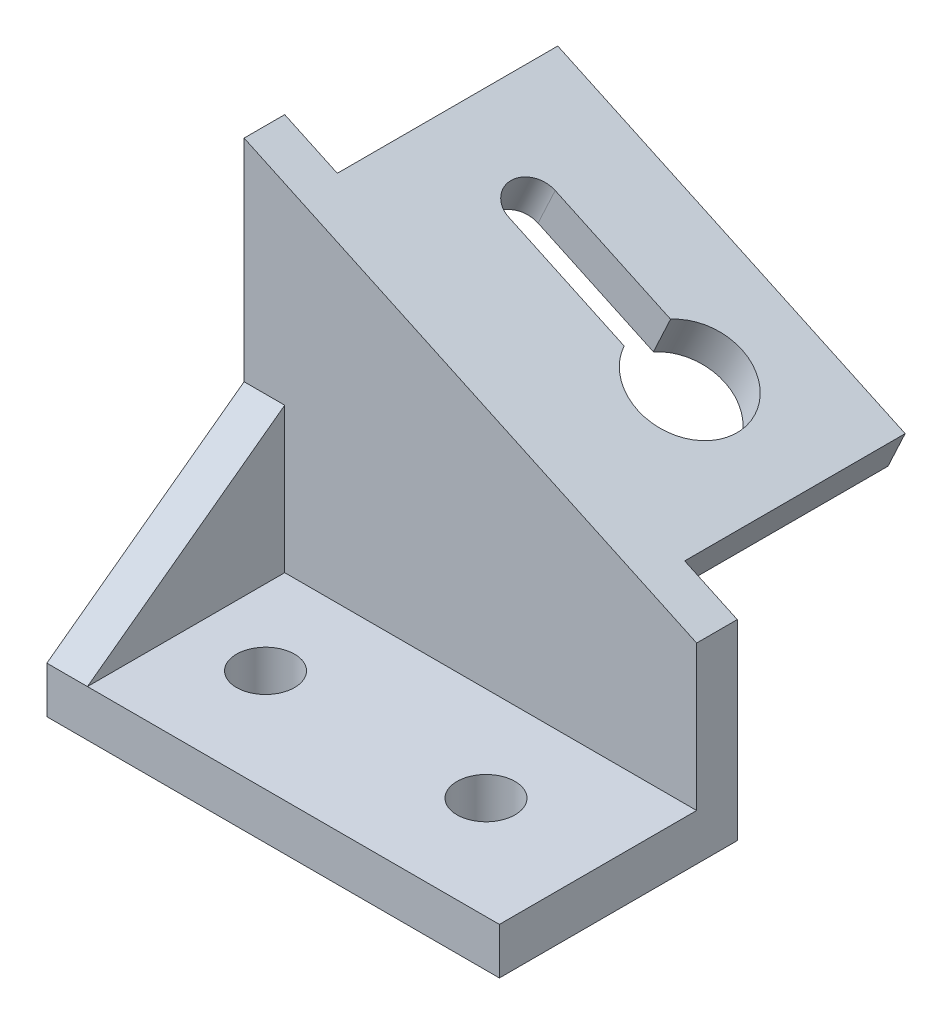
ISO-10303-21;
HEADER;
FILE_DESCRIPTION(('STEP AP214'),'2;1');
FILE_NAME('part.step','',(''),(''),'','','');
FILE_SCHEMA(('AUTOMOTIVE_DESIGN { 1 0 10303 214 1 1 1 1 }'));
ENDSEC;
DATA;
#1=APPLICATION_CONTEXT('core data for automotive mechanical design processes');
#2=APPLICATION_PROTOCOL_DEFINITION('international standard','automotive_design',2000,#1);
#3=PRODUCT_CONTEXT('',#1,'mechanical');
#4=PRODUCT('Part','Part','',(#3));
#5=PRODUCT_RELATED_PRODUCT_CATEGORY('part','',(#4));
#6=PRODUCT_DEFINITION_FORMATION('','',#4);
#7=PRODUCT_DEFINITION_CONTEXT('part definition',#1,'design');
#8=PRODUCT_DEFINITION('design','',#6,#7);
#9=PRODUCT_DEFINITION_SHAPE('','',#8);
#10=(LENGTH_UNIT() NAMED_UNIT(*) SI_UNIT(.MILLI.,.METRE.));
#11=(NAMED_UNIT(*) PLANE_ANGLE_UNIT() SI_UNIT($,.RADIAN.));
#12=(NAMED_UNIT(*) SI_UNIT($,.STERADIAN.) SOLID_ANGLE_UNIT());
#13=UNCERTAINTY_MEASURE_WITH_UNIT(LENGTH_MEASURE(1.E-05),#10,'distance_accuracy_value','');
#14=(GEOMETRIC_REPRESENTATION_CONTEXT(3) GLOBAL_UNCERTAINTY_ASSIGNED_CONTEXT((#13)) GLOBAL_UNIT_ASSIGNED_CONTEXT((#10,
#11,#12)) REPRESENTATION_CONTEXT('',''));
#15=CARTESIAN_POINT('',(0.,0.,0.));
#16=DIRECTION('',(0.,0.,1.));
#17=DIRECTION('',(1.,0.,0.));
#18=AXIS2_PLACEMENT_3D('',#15,#16,#17);
#19=CARTESIAN_POINT('',(0.,80.,-41.));
#20=DIRECTION('',(0.,0.,1.));
#21=DIRECTION('',(1.,0.,0.));
#22=AXIS2_PLACEMENT_3D('',#19,#20,#21);
#23=PLANE('',#22);
#24=DIRECTION('',(0.422618261740694,0.906307787036653,0.));
#25=VECTOR('',#24,1.);
#26=CARTESIAN_POINT('',(6.10475003818167,58.8016602094258,-41.));
#27=LINE('',#26,#25);
#28=CARTESIAN_POINT('',(6.10475003818167,58.8016602094258,-41.));
#29=VERTEX_POINT('',#28);
#30=CARTESIAN_POINT('',(9.06307787036652,65.1458147186823,-41.));
#31=VERTEX_POINT('',#30);
#32=EDGE_CURVE('E214',#29,#31,#27,.T.);
#33=ORIENTED_EDGE('',*,*,#32,.F.);
#34=DIRECTION('',(-0.906307787036653,0.422618261740694,0.));
#35=VECTOR('',#34,1.);
#36=CARTESIAN_POINT('',(23.6126887015027,50.6375743322113,-41.));
#37=LINE('',#36,#35);
#38=CARTESIAN_POINT('',(65.9785942974487,30.8820281081504,-41.));
#39=VERTEX_POINT('',#38);
#40=EDGE_CURVE('E188',#39,#29,#37,.T.);
#41=ORIENTED_EDGE('',*,*,#40,.F.);
#42=DIRECTION('',(0.422618261740694,0.906307787036653,0.));
#43=VECTOR('',#42,1.);
#44=CARTESIAN_POINT('',(65.9785942974487,30.8820281081504,-41.));
#45=LINE('',#44,#43);
#46=CARTESIAN_POINT('',(68.9369221296335,37.2261826174069,-41.));
#47=VERTEX_POINT('',#46);
#48=EDGE_CURVE('E213',#39,#47,#45,.T.);
#49=ORIENTED_EDGE('',*,*,#48,.T.);
#50=DIRECTION('',(-0.906307787036653,0.422618261740694,0.));
#51=VECTOR('',#50,1.);
#52=CARTESIAN_POINT('',(-4.07076119107122,71.2702244540059,-41.));
#53=LINE('',#52,#51);
#54=CARTESIAN_POINT('',(78.,33.,-41.));
#55=VERTEX_POINT('',#54);
#56=EDGE_CURVE('E281',#55,#47,#53,.T.);
#57=ORIENTED_EDGE('',*,*,#56,.F.);
#58=DIRECTION('',(0.,-1.,0.));
#59=VECTOR('',#58,1.);
#60=CARTESIAN_POINT('',(78.,80.,-41.));
#61=LINE('',#60,#59);
#62=CARTESIAN_POINT('',(78.,0.,-41.));
#63=VERTEX_POINT('',#62);
#64=EDGE_CURVE('E237',#55,#63,#61,.T.);
#65=ORIENTED_EDGE('',*,*,#64,.T.);
#66=DIRECTION('',(-1.,0.,0.));
#67=VECTOR('',#66,1.);
#68=CARTESIAN_POINT('',(0.,0.,-41.));
#69=LINE('',#68,#67);
#70=CARTESIAN_POINT('',(0.,0.,-41.));
#71=VERTEX_POINT('',#70);
#72=EDGE_CURVE('E229',#63,#71,#69,.T.);
#73=ORIENTED_EDGE('',*,*,#72,.T.);
#74=DIRECTION('',(0.,-1.,0.));
#75=VECTOR('',#74,1.);
#76=CARTESIAN_POINT('',(0.,80.,-41.));
#77=LINE('',#76,#75);
#78=CARTESIAN_POINT('',(0.,69.3719973360893,-41.));
#79=VERTEX_POINT('',#78);
#80=EDGE_CURVE('E234',#79,#71,#77,.T.);
#81=ORIENTED_EDGE('',*,*,#80,.F.);
#82=EDGE_CURVE('E284',#31,#79,#53,.T.);
#83=ORIENTED_EDGE('',*,*,#82,.F.);
#84=EDGE_LOOP('',(#33,#41,#49,#57,#65,#73,#81,#83));
#85=FACE_BOUND('',#84,.T.);
#86=ADVANCED_FACE('F41',(#85),#23,.F.);
#87=CARTESIAN_POINT('',(0.,33.,0.));
#88=DIRECTION('',(1.,0.,0.));
#89=DIRECTION('',(0.,0.,-1.));
#90=AXIS2_PLACEMENT_3D('',#87,#88,#89);
#91=PLANE('',#90);
#92=DIRECTION('',(0.,-1.,0.));
#93=VECTOR('',#92,1.);
#94=CARTESIAN_POINT('',(0.,33.,0.));
#95=LINE('',#94,#93);
#96=CARTESIAN_POINT('',(0.,7.99999999999993,0.));
#97=VERTEX_POINT('',#96);
#98=CARTESIAN_POINT('',(0.,0.,0.));
#99=VERTEX_POINT('',#98);
#100=EDGE_CURVE('E243',#97,#99,#95,.T.);
#101=ORIENTED_EDGE('',*,*,#100,.F.);
#102=DIRECTION('',(0.,0.592390450477517,-0.805651012649425));
#103=VECTOR('',#102,1.);
#104=CARTESIAN_POINT('',(0.,33.,-34.0000000000002));
#105=LINE('',#104,#103);
#106=CARTESIAN_POINT('',(0.,33.,-34.));
#107=VERTEX_POINT('',#106);
#108=EDGE_CURVE('E11',#97,#107,#105,.T.);
#109=ORIENTED_EDGE('',*,*,#108,.T.);
#110=DIRECTION('',(0.,-1.,0.));
#111=VECTOR('',#110,1.);
#112=CARTESIAN_POINT('',(0.,80.,-34.));
#113=LINE('',#112,#111);
#114=CARTESIAN_POINT('',(0.,69.3719973360893,-34.));
#115=VERTEX_POINT('',#114);
#116=EDGE_CURVE('E232',#115,#107,#113,.T.);
#117=ORIENTED_EDGE('',*,*,#116,.F.);
#118=DIRECTION('',(0.,0.,1.));
#119=VECTOR('',#118,1.);
#120=CARTESIAN_POINT('',(0.,69.3719973360893,-114.));
#121=LINE('',#120,#119);
#122=EDGE_CURVE('E221',#79,#115,#121,.T.);
#123=ORIENTED_EDGE('',*,*,#122,.F.);
#124=ORIENTED_EDGE('',*,*,#80,.T.);
#125=DIRECTION('',(0.,0.,1.));
#126=VECTOR('',#125,1.);
#127=CARTESIAN_POINT('',(0.,0.,0.));
#128=LINE('',#127,#126);
#129=EDGE_CURVE('E238',#71,#99,#128,.T.);
#130=ORIENTED_EDGE('',*,*,#129,.T.);
#131=EDGE_LOOP('',(#101,#109,#117,#123,#124,#130));
#132=FACE_BOUND('',#131,.T.);
#133=ADVANCED_FACE('F302',(#132),#91,.F.);
#134=CARTESIAN_POINT('',(0.,80.,-34.));
#135=DIRECTION('',(0.,0.,1.));
#136=DIRECTION('',(1.,0.,0.));
#137=AXIS2_PLACEMENT_3D('',#134,#135,#136);
#138=PLANE('',#137);
#139=DIRECTION('',(0.,-1.,0.));
#140=VECTOR('',#139,1.);
#141=CARTESIAN_POINT('',(78.,80.,-34.));
#142=LINE('',#141,#140);
#143=CARTESIAN_POINT('',(78.,33.,-34.));
#144=VERTEX_POINT('',#143);
#145=CARTESIAN_POINT('',(78.,7.99999999999999,-34.));
#146=VERTEX_POINT('',#145);
#147=EDGE_CURVE('E236',#144,#146,#142,.T.);
#148=ORIENTED_EDGE('',*,*,#147,.F.);
#149=DIRECTION('',(-0.906307787036653,0.422618261740694,0.));
#150=VECTOR('',#149,1.);
#151=CARTESIAN_POINT('',(26.5710165336876,56.9817288414679,-34.));
#152=LINE('',#151,#150);
#153=EDGE_CURVE('E209',#144,#115,#152,.T.);
#154=ORIENTED_EDGE('',*,*,#153,.T.);
#155=ORIENTED_EDGE('',*,*,#116,.T.);
#156=DIRECTION('',(-1.,0.,0.));
#157=VECTOR('',#156,1.);
#158=CARTESIAN_POINT('',(0.,33.,-34.));
#159=LINE('',#158,#157);
#160=CARTESIAN_POINT('',(7.,33.,-34.));
#161=VERTEX_POINT('',#160);
#162=EDGE_CURVE('E244',#161,#107,#159,.T.);
#163=ORIENTED_EDGE('',*,*,#162,.F.);
#164=DIRECTION('',(0.,-1.,0.));
#165=VECTOR('',#164,1.);
#166=CARTESIAN_POINT('',(7.,33.,-34.));
#167=LINE('',#166,#165);
#168=CARTESIAN_POINT('',(7.,8.,-34.));
#169=VERTEX_POINT('',#168);
#170=EDGE_CURVE('E248',#161,#169,#167,.T.);
#171=ORIENTED_EDGE('',*,*,#170,.T.);
#172=DIRECTION('',(-1.,0.,0.));
#173=VECTOR('',#172,1.);
#174=CARTESIAN_POINT('',(0.,8.,-34.));
#175=LINE('',#174,#173);
#176=EDGE_CURVE('E256',#146,#169,#175,.T.);
#177=ORIENTED_EDGE('',*,*,#176,.F.);
#178=EDGE_LOOP('',(#148,#154,#155,#163,#171,#177));
#179=FACE_BOUND('',#178,.T.);
#180=ADVANCED_FACE('F301',(#179),#138,.T.);
#181=CARTESIAN_POINT('',(0.,8.,0.));
#182=DIRECTION('',(0.,0.,-1.));
#183=DIRECTION('',(-1.,0.,0.));
#184=AXIS2_PLACEMENT_3D('',#181,#182,#183);
#185=PLANE('',#184);
#186=DIRECTION('',(1.,0.,0.));
#187=VECTOR('',#186,1.);
#188=CARTESIAN_POINT('',(0.,8.,0.));
#189=LINE('',#188,#187);
#190=CARTESIAN_POINT('',(7.,8.,0.));
#191=VERTEX_POINT('',#190);
#192=CARTESIAN_POINT('',(78.,8.,0.));
#193=VERTEX_POINT('',#192);
#194=EDGE_CURVE('E262',#191,#193,#189,.T.);
#195=ORIENTED_EDGE('',*,*,#194,.F.);
#196=DIRECTION('',(-1.,0.,0.));
#197=VECTOR('',#196,1.);
#198=CARTESIAN_POINT('',(0.,7.99999999999993,0.));
#199=LINE('',#198,#197);
#200=EDGE_CURVE('E49',#191,#97,#199,.T.);
#201=ORIENTED_EDGE('',*,*,#200,.T.);
#202=ORIENTED_EDGE('',*,*,#100,.T.);
#203=DIRECTION('',(1.,0.,0.));
#204=VECTOR('',#203,1.);
#205=CARTESIAN_POINT('',(0.,0.,0.));
#206=LINE('',#205,#204);
#207=CARTESIAN_POINT('',(78.,0.,0.));
#208=VERTEX_POINT('',#207);
#209=EDGE_CURVE('E274',#99,#208,#206,.T.);
#210=ORIENTED_EDGE('',*,*,#209,.T.);
#211=DIRECTION('',(0.,-1.,0.));
#212=VECTOR('',#211,1.);
#213=CARTESIAN_POINT('',(78.,8.,0.));
#214=LINE('',#213,#212);
#215=EDGE_CURVE('E267',#193,#208,#214,.T.);
#216=ORIENTED_EDGE('',*,*,#215,.F.);
#217=EDGE_LOOP('',(#195,#201,#202,#210,#216));
#218=FACE_BOUND('',#217,.T.);
#219=ADVANCED_FACE('F299',(#218),#185,.F.);
#220=CARTESIAN_POINT('',(20.,8.,-17.6950665843996));
#221=DIRECTION('',(0.,-1.,0.));
#222=DIRECTION('',(0.,0.,-1.));
#223=AXIS2_PLACEMENT_3D('',#220,#221,#222);
#224=CYLINDRICAL_SURFACE('',#223,5.);
#225=CARTESIAN_POINT('',(20.,8.,-17.6950665843996));
#226=DIRECTION('',(0.,1.,0.));
#227=DIRECTION('',(0.,0.,1.));
#228=AXIS2_PLACEMENT_3D('',#225,#226,#227);
#229=CIRCLE('',#228,5.);
#230=CARTESIAN_POINT('',(20.,8.,-12.6950665843996));
#231=VERTEX_POINT('',#230);
#232=EDGE_CURVE('E255',#231,#231,#229,.T.);
#233=ORIENTED_EDGE('',*,*,#232,.T.);
#234=EDGE_LOOP('',(#233));
#235=FACE_BOUND('',#234,.T.);
#236=CARTESIAN_POINT('',(20.,0.,-17.6950665843996));
#237=DIRECTION('',(0.,1.,0.));
#238=DIRECTION('',(0.,0.,1.));
#239=AXIS2_PLACEMENT_3D('',#236,#237,#238);
#240=CIRCLE('',#239,5.);
#241=CARTESIAN_POINT('',(20.,0.,-12.6950665843996));
#242=VERTEX_POINT('',#241);
#243=EDGE_CURVE('E275',#242,#242,#240,.T.);
#244=ORIENTED_EDGE('',*,*,#243,.F.);
#245=EDGE_LOOP('',(#244));
#246=FACE_BOUND('',#245,.T.);
#247=ADVANCED_FACE('F356',(#235,#246),#224,.F.);
#248=CARTESIAN_POINT('',(58.,8.,-17.6950665843996));
#249=DIRECTION('',(0.,-1.,0.));
#250=DIRECTION('',(0.,0.,-1.));
#251=AXIS2_PLACEMENT_3D('',#248,#249,#250);
#252=CYLINDRICAL_SURFACE('',#251,5.);
#253=CARTESIAN_POINT('',(58.,8.,-17.6950665843996));
#254=DIRECTION('',(0.,1.,0.));
#255=DIRECTION('',(0.,0.,1.));
#256=AXIS2_PLACEMENT_3D('',#253,#254,#255);
#257=CIRCLE('',#256,5.);
#258=CARTESIAN_POINT('',(58.,8.,-12.6950665843996));
#259=VERTEX_POINT('',#258);
#260=EDGE_CURVE('E253',#259,#259,#257,.T.);
#261=ORIENTED_EDGE('',*,*,#260,.T.);
#262=EDGE_LOOP('',(#261));
#263=FACE_BOUND('',#262,.T.);
#264=CARTESIAN_POINT('',(58.,0.,-17.6950665843996));
#265=DIRECTION('',(0.,1.,0.));
#266=DIRECTION('',(0.,0.,1.));
#267=AXIS2_PLACEMENT_3D('',#264,#265,#266);
#268=CIRCLE('',#267,5.);
#269=CARTESIAN_POINT('',(58.,0.,-12.6950665843996));
#270=VERTEX_POINT('',#269);
#271=EDGE_CURVE('E246',#270,#270,#268,.T.);
#272=ORIENTED_EDGE('',*,*,#271,.F.);
#273=EDGE_LOOP('',(#272));
#274=FACE_BOUND('',#273,.T.);
#275=ADVANCED_FACE('F364',(#263,#274),#252,.F.);
#276=CARTESIAN_POINT('',(78.,8.,0.));
#277=DIRECTION('',(-1.,0.,0.));
#278=DIRECTION('',(0.,0.,1.));
#279=AXIS2_PLACEMENT_3D('',#276,#277,#278);
#280=PLANE('',#279);
#281=ORIENTED_EDGE('',*,*,#64,.F.);
#282=DIRECTION('',(0.,0.,1.));
#283=VECTOR('',#282,1.);
#284=CARTESIAN_POINT('',(78.,33.,-114.));
#285=LINE('',#284,#283);
#286=EDGE_CURVE('E224',#55,#144,#285,.T.);
#287=ORIENTED_EDGE('',*,*,#286,.T.);
#288=ORIENTED_EDGE('',*,*,#147,.T.);
#289=DIRECTION('',(0.,0.,-1.));
#290=VECTOR('',#289,1.);
#291=CARTESIAN_POINT('',(78.,8.,0.));
#292=LINE('',#291,#290);
#293=EDGE_CURVE('E266',#193,#146,#292,.T.);
#294=ORIENTED_EDGE('',*,*,#293,.F.);
#295=ORIENTED_EDGE('',*,*,#215,.T.);
#296=DIRECTION('',(0.,0.,-1.));
#297=VECTOR('',#296,1.);
#298=CARTESIAN_POINT('',(78.,0.,0.));
#299=LINE('',#298,#297);
#300=EDGE_CURVE('E254',#208,#63,#299,.T.);
#301=ORIENTED_EDGE('',*,*,#300,.T.);
#302=EDGE_LOOP('',(#281,#287,#288,#294,#295,#301));
#303=FACE_BOUND('',#302,.T.);
#304=ADVANCED_FACE('F315',(#303),#280,.F.);
#305=CARTESIAN_POINT('',(0.,8.,0.));
#306=DIRECTION('',(0.,1.,0.));
#307=DIRECTION('',(0.,0.,1.));
#308=AXIS2_PLACEMENT_3D('',#305,#306,#307);
#309=PLANE('',#308);
#310=ORIENTED_EDGE('',*,*,#260,.F.);
#311=EDGE_LOOP('',(#310));
#312=FACE_BOUND('',#311,.T.);
#313=ORIENTED_EDGE('',*,*,#232,.F.);
#314=EDGE_LOOP('',(#313));
#315=FACE_BOUND('',#314,.T.);
#316=ORIENTED_EDGE('',*,*,#176,.T.);
#317=DIRECTION('',(0.,0.,1.));
#318=VECTOR('',#317,1.);
#319=CARTESIAN_POINT('',(7.,8.,0.));
#320=LINE('',#319,#318);
#321=EDGE_CURVE('E261',#169,#191,#320,.T.);
#322=ORIENTED_EDGE('',*,*,#321,.T.);
#323=ORIENTED_EDGE('',*,*,#194,.T.);
#324=ORIENTED_EDGE('',*,*,#293,.T.);
#325=EDGE_LOOP('',(#316,#322,#323,#324));
#326=FACE_BOUND('',#325,.T.);
#327=ADVANCED_FACE('F291',(#312,#315,#326),#309,.T.);
#328=CARTESIAN_POINT('',(0.,0.,0.));
#329=DIRECTION('',(0.,1.,0.));
#330=DIRECTION('',(0.,0.,1.));
#331=AXIS2_PLACEMENT_3D('',#328,#329,#330);
#332=PLANE('',#331);
#333=ORIENTED_EDGE('',*,*,#271,.T.);
#334=EDGE_LOOP('',(#333));
#335=FACE_BOUND('',#334,.T.);
#336=ORIENTED_EDGE('',*,*,#243,.T.);
#337=EDGE_LOOP('',(#336));
#338=FACE_BOUND('',#337,.T.);
#339=ORIENTED_EDGE('',*,*,#129,.F.);
#340=ORIENTED_EDGE('',*,*,#72,.F.);
#341=ORIENTED_EDGE('',*,*,#300,.F.);
#342=ORIENTED_EDGE('',*,*,#209,.F.);
#343=EDGE_LOOP('',(#339,#340,#341,#342));
#344=FACE_BOUND('',#343,.T.);
#345=ADVANCED_FACE('F332',(#335,#338,#344),#332,.F.);
#346=CARTESIAN_POINT('',(7.,33.,0.));
#347=DIRECTION('',(1.,0.,0.));
#348=DIRECTION('',(0.,0.,-1.));
#349=AXIS2_PLACEMENT_3D('',#346,#347,#348);
#350=PLANE('',#349);
#351=ORIENTED_EDGE('',*,*,#170,.F.);
#352=DIRECTION('',(0.,-0.592390450477517,0.805651012649425));
#353=VECTOR('',#352,1.);
#354=CARTESIAN_POINT('',(7.,16.7731611454239,-11.9314991577766));
#355=LINE('',#354,#353);
#356=EDGE_CURVE('E282',#161,#191,#355,.T.);
#357=ORIENTED_EDGE('',*,*,#356,.T.);
#358=ORIENTED_EDGE('',*,*,#321,.F.);
#359=EDGE_LOOP('',(#351,#357,#358));
#360=FACE_BOUND('',#359,.T.);
#361=ADVANCED_FACE('F289',(#360),#350,.T.);
#362=CARTESIAN_POINT('',(26.5710165336876,56.9817288414679,-114.));
#363=DIRECTION('',(0.422618261740694,0.906307787036653,0.));
#364=DIRECTION('',(-0.906307787036653,0.422618261740694,0.));
#365=AXIS2_PLACEMENT_3D('',#362,#363,#364);
#366=PLANE('',#365);
#367=ORIENTED_EDGE('',*,*,#56,.T.);
#368=DIRECTION('',(0.,0.,1.));
#369=VECTOR('',#368,1.);
#370=CARTESIAN_POINT('',(68.9369221296335,37.2261826174069,0.));
#371=LINE('',#370,#369);
#372=CARTESIAN_POINT('',(68.9369221296335,37.2261826174069,-79.));
#373=VERTEX_POINT('',#372);
#374=EDGE_CURVE('E63',#373,#47,#371,.T.);
#375=ORIENTED_EDGE('',*,*,#374,.F.);
#376=DIRECTION('',(0.906307787036653,-0.422618261740694,0.));
#377=VECTOR('',#376,1.);
#378=CARTESIAN_POINT('',(26.5710165336876,56.9817288414679,-79.));
#379=LINE('',#378,#377);
#380=CARTESIAN_POINT('',(9.06307787036653,65.1458147186823,-79.));
#381=VERTEX_POINT('',#380);
#382=EDGE_CURVE('E179',#381,#373,#379,.T.);
#383=ORIENTED_EDGE('',*,*,#382,.F.);
#384=DIRECTION('',(0.,0.,-1.));
#385=VECTOR('',#384,1.);
#386=CARTESIAN_POINT('',(9.06307787036653,65.1458147186823,0.));
#387=LINE('',#386,#385);
#388=EDGE_CURVE('E201',#31,#381,#387,.T.);
#389=ORIENTED_EDGE('',*,*,#388,.F.);
#390=ORIENTED_EDGE('',*,*,#82,.T.);
#391=ORIENTED_EDGE('',*,*,#122,.T.);
#392=ORIENTED_EDGE('',*,*,#153,.F.);
#393=ORIENTED_EDGE('',*,*,#286,.F.);
#394=EDGE_LOOP('',(#367,#375,#383,#389,#390,#391,#392,#393));
#395=FACE_BOUND('',#394,.T.);
#396=DIRECTION('',(0.906307787036653,-0.422618261740694,0.));
#397=VECTOR('',#396,1.);
#398=CARTESIAN_POINT('',(26.5710165336876,56.9817288414679,-56.));
#399=LINE('',#398,#397);
#400=CARTESIAN_POINT('',(23.6215327778009,58.3570957044416,-56.));
#401=VERTEX_POINT('',#400);
#402=CARTESIAN_POINT('',(43.5038794105209,49.0858052075122,-56.));
#403=VERTEX_POINT('',#402);
#404=EDGE_CURVE('E194',#401,#403,#399,.T.);
#405=ORIENTED_EDGE('',*,*,#404,.F.);
#406=CARTESIAN_POINT('',(23.6215327778009,58.3570957044416,-60.));
#407=DIRECTION('',(0.422618261740693,0.906307787036653,0.));
#408=DIRECTION('',(-0.906307787036653,0.422618261740694,0.));
#409=AXIS2_PLACEMENT_3D('',#406,#407,#408);
#410=CIRCLE('',#409,4.);
#411=CARTESIAN_POINT('',(23.6215327778009,58.3570957044416,-64.));
#412=VERTEX_POINT('',#411);
#413=EDGE_CURVE('E166',#412,#401,#410,.T.);
#414=ORIENTED_EDGE('',*,*,#413,.F.);
#415=DIRECTION('',(0.906307787036653,-0.422618261740694,0.));
#416=VECTOR('',#415,1.);
#417=CARTESIAN_POINT('',(26.5710165336876,56.9817288414679,-64.));
#418=LINE('',#417,#416);
#419=CARTESIAN_POINT('',(43.5038794105209,49.0858052075122,-64.));
#420=VERTEX_POINT('',#419);
#421=EDGE_CURVE('E197',#412,#420,#418,.T.);
#422=ORIENTED_EDGE('',*,*,#421,.T.);
#423=CARTESIAN_POINT('',(50.8107663889004,45.6785478522208,-60.));
#424=DIRECTION('',(0.422618261740693,0.906307787036653,0.));
#425=DIRECTION('',(-0.906307787036653,0.422618261740694,0.));
#426=AXIS2_PLACEMENT_3D('',#423,#424,#425);
#427=CIRCLE('',#426,8.99999999999999);
#428=EDGE_CURVE('E199',#403,#420,#427,.T.);
#429=ORIENTED_EDGE('',*,*,#428,.F.);
#430=EDGE_LOOP('',(#405,#414,#422,#429));
#431=FACE_BOUND('',#430,.T.);
#432=ADVANCED_FACE('F307',(#395,#431),#366,.T.);
#433=CARTESIAN_POINT('',(6.10475003818168,58.8016602094258,0.));
#434=DIRECTION('',(0.906307787036653,-0.422618261740694,0.));
#435=DIRECTION('',(0.422618261740694,0.906307787036653,0.));
#436=AXIS2_PLACEMENT_3D('',#433,#434,#435);
#437=PLANE('',#436);
#438=ORIENTED_EDGE('',*,*,#388,.T.);
#439=DIRECTION('',(0.422618261740694,0.906307787036653,0.));
#440=VECTOR('',#439,1.);
#441=CARTESIAN_POINT('',(6.10475003818167,58.8016602094258,-79.));
#442=LINE('',#441,#440);
#443=CARTESIAN_POINT('',(6.10475003818167,58.8016602094258,-79.));
#444=VERTEX_POINT('',#443);
#445=EDGE_CURVE('E210',#444,#381,#442,.T.);
#446=ORIENTED_EDGE('',*,*,#445,.F.);
#447=DIRECTION('',(0.,0.,-1.));
#448=VECTOR('',#447,1.);
#449=CARTESIAN_POINT('',(6.10475003818168,58.8016602094258,0.));
#450=LINE('',#449,#448);
#451=EDGE_CURVE('E189',#29,#444,#450,.T.);
#452=ORIENTED_EDGE('',*,*,#451,.F.);
#453=ORIENTED_EDGE('',*,*,#32,.T.);
#454=EDGE_LOOP('',(#438,#446,#452,#453));
#455=FACE_BOUND('',#454,.T.);
#456=ADVANCED_FACE('F330',(#455),#437,.F.);
#457=CARTESIAN_POINT('',(23.6126887015027,50.6375743322113,-79.));
#458=DIRECTION('',(0.,0.,1.));
#459=DIRECTION('',(1.,0.,0.));
#460=AXIS2_PLACEMENT_3D('',#457,#458,#459);
#461=PLANE('',#460);
#462=ORIENTED_EDGE('',*,*,#382,.T.);
#463=DIRECTION('',(0.422618261740694,0.906307787036653,0.));
#464=VECTOR('',#463,1.);
#465=CARTESIAN_POINT('',(65.9785942974486,30.8820281081503,-79.));
#466=LINE('',#465,#464);
#467=CARTESIAN_POINT('',(65.9785942974486,30.8820281081503,-79.));
#468=VERTEX_POINT('',#467);
#469=EDGE_CURVE('E211',#468,#373,#466,.T.);
#470=ORIENTED_EDGE('',*,*,#469,.F.);
#471=DIRECTION('',(0.906307787036653,-0.422618261740694,0.));
#472=VECTOR('',#471,1.);
#473=CARTESIAN_POINT('',(23.6126887015027,50.6375743322113,-79.));
#474=LINE('',#473,#472);
#475=EDGE_CURVE('E173',#444,#468,#474,.T.);
#476=ORIENTED_EDGE('',*,*,#475,.F.);
#477=ORIENTED_EDGE('',*,*,#445,.T.);
#478=EDGE_LOOP('',(#462,#470,#476,#477));
#479=FACE_BOUND('',#478,.T.);
#480=ADVANCED_FACE('F322',(#479),#461,.F.);
#481=CARTESIAN_POINT('',(65.9785942974487,30.8820281081504,0.));
#482=DIRECTION('',(-0.906307787036653,0.422618261740694,0.));
#483=DIRECTION('',(-0.422618261740694,-0.906307787036653,0.));
#484=AXIS2_PLACEMENT_3D('',#481,#482,#483);
#485=PLANE('',#484);
#486=ORIENTED_EDGE('',*,*,#374,.T.);
#487=ORIENTED_EDGE('',*,*,#48,.F.);
#488=DIRECTION('',(0.,0.,1.));
#489=VECTOR('',#488,1.);
#490=CARTESIAN_POINT('',(65.9785942974487,30.8820281081504,0.));
#491=LINE('',#490,#489);
#492=EDGE_CURVE('E192',#468,#39,#491,.T.);
#493=ORIENTED_EDGE('',*,*,#492,.F.);
#494=ORIENTED_EDGE('',*,*,#469,.T.);
#495=EDGE_LOOP('',(#486,#487,#493,#494));
#496=FACE_BOUND('',#495,.T.);
#497=ADVANCED_FACE('F432',(#496),#485,.F.);
#498=CARTESIAN_POINT('',(23.6126887015027,50.6375743322113,-56.));
#499=DIRECTION('',(0.,0.,1.));
#500=DIRECTION('',(1.,0.,0.));
#501=AXIS2_PLACEMENT_3D('',#498,#499,#500);
#502=PLANE('',#501);
#503=ORIENTED_EDGE('',*,*,#404,.T.);
#504=DIRECTION('',(0.422618261740694,0.906307787036653,0.));
#505=VECTOR('',#504,1.);
#506=CARTESIAN_POINT('',(40.545551578336,42.7416506982556,-56.));
#507=LINE('',#506,#505);
#508=CARTESIAN_POINT('',(40.545551578336,42.7416506982556,-56.));
#509=VERTEX_POINT('',#508);
#510=EDGE_CURVE('E178',#509,#403,#507,.T.);
#511=ORIENTED_EDGE('',*,*,#510,.F.);
#512=DIRECTION('',(0.906307787036653,-0.422618261740694,0.));
#513=VECTOR('',#512,1.);
#514=CARTESIAN_POINT('',(23.6126887015027,50.6375743322113,-56.));
#515=LINE('',#514,#513);
#516=CARTESIAN_POINT('',(20.663204945616,52.012941195185,-56.));
#517=VERTEX_POINT('',#516);
#518=EDGE_CURVE('E157',#517,#509,#515,.T.);
#519=ORIENTED_EDGE('',*,*,#518,.F.);
#520=DIRECTION('',(0.422618261740694,0.906307787036653,0.));
#521=VECTOR('',#520,1.);
#522=CARTESIAN_POINT('',(20.663204945616,52.012941195185,-56.));
#523=LINE('',#522,#521);
#524=EDGE_CURVE('E167',#517,#401,#523,.T.);
#525=ORIENTED_EDGE('',*,*,#524,.T.);
#526=EDGE_LOOP('',(#503,#511,#519,#525));
#527=FACE_BOUND('',#526,.T.);
#528=ADVANCED_FACE('F177',(#527),#502,.F.);
#529=CARTESIAN_POINT('',(47.8524385567156,39.3343933429642,-60.));
#530=DIRECTION('',(0.422618261740694,0.906307787036653,0.));
#531=DIRECTION('',(-0.906307787036653,0.422618261740694,0.));
#532=AXIS2_PLACEMENT_3D('',#529,#530,#531);
#533=CYLINDRICAL_SURFACE('',#532,8.99999999999999);
#534=ORIENTED_EDGE('',*,*,#428,.T.);
#535=DIRECTION('',(0.422618261740694,0.906307787036653,0.));
#536=VECTOR('',#535,1.);
#537=CARTESIAN_POINT('',(40.545551578336,42.7416506982556,-64.));
#538=LINE('',#537,#536);
#539=CARTESIAN_POINT('',(40.545551578336,42.7416506982556,-64.));
#540=VERTEX_POINT('',#539);
#541=EDGE_CURVE('E217',#540,#420,#538,.T.);
#542=ORIENTED_EDGE('',*,*,#541,.F.);
#543=CARTESIAN_POINT('',(47.8524385567156,39.3343933429642,-60.));
#544=DIRECTION('',(0.422618261740693,0.906307787036653,0.));
#545=DIRECTION('',(-0.906307787036653,0.422618261740694,0.));
#546=AXIS2_PLACEMENT_3D('',#543,#544,#545);
#547=CIRCLE('',#546,8.99999999999999);
#548=EDGE_CURVE('E184',#509,#540,#547,.T.);
#549=ORIENTED_EDGE('',*,*,#548,.F.);
#550=ORIENTED_EDGE('',*,*,#510,.T.);
#551=EDGE_LOOP('',(#534,#542,#549,#550));
#552=FACE_BOUND('',#551,.T.);
#553=ADVANCED_FACE('F448',(#552),#533,.F.);
#554=CARTESIAN_POINT('',(23.6126887015027,50.6375743322113,-64.));
#555=DIRECTION('',(0.,0.,1.));
#556=DIRECTION('',(1.,0.,0.));
#557=AXIS2_PLACEMENT_3D('',#554,#555,#556);
#558=PLANE('',#557);
#559=ORIENTED_EDGE('',*,*,#421,.F.);
#560=DIRECTION('',(0.422618261740694,0.906307787036653,0.));
#561=VECTOR('',#560,1.);
#562=CARTESIAN_POINT('',(20.663204945616,52.012941195185,-64.));
#563=LINE('',#562,#561);
#564=CARTESIAN_POINT('',(20.663204945616,52.012941195185,-64.));
#565=VERTEX_POINT('',#564);
#566=EDGE_CURVE('E175',#565,#412,#563,.T.);
#567=ORIENTED_EDGE('',*,*,#566,.F.);
#568=DIRECTION('',(0.906307787036653,-0.422618261740694,0.));
#569=VECTOR('',#568,1.);
#570=CARTESIAN_POINT('',(23.6126887015027,50.6375743322113,-64.));
#571=LINE('',#570,#569);
#572=EDGE_CURVE('E165',#565,#540,#571,.T.);
#573=ORIENTED_EDGE('',*,*,#572,.T.);
#574=ORIENTED_EDGE('',*,*,#541,.T.);
#575=EDGE_LOOP('',(#559,#567,#573,#574));
#576=FACE_BOUND('',#575,.T.);
#577=ADVANCED_FACE('F457',(#576),#558,.T.);
#578=CARTESIAN_POINT('',(20.663204945616,52.012941195185,-60.));
#579=DIRECTION('',(0.422618261740694,0.906307787036653,0.));
#580=DIRECTION('',(-0.906307787036653,0.422618261740694,0.));
#581=AXIS2_PLACEMENT_3D('',#578,#579,#580);
#582=CYLINDRICAL_SURFACE('',#581,4.);
#583=ORIENTED_EDGE('',*,*,#413,.T.);
#584=ORIENTED_EDGE('',*,*,#524,.F.);
#585=CARTESIAN_POINT('',(20.663204945616,52.012941195185,-60.));
#586=DIRECTION('',(0.422618261740693,0.906307787036653,0.));
#587=DIRECTION('',(-0.906307787036653,0.422618261740694,0.));
#588=AXIS2_PLACEMENT_3D('',#585,#586,#587);
#589=CIRCLE('',#588,4.);
#590=EDGE_CURVE('E152',#565,#517,#589,.T.);
#591=ORIENTED_EDGE('',*,*,#590,.F.);
#592=ORIENTED_EDGE('',*,*,#566,.T.);
#593=EDGE_LOOP('',(#583,#584,#591,#592));
#594=FACE_BOUND('',#593,.T.);
#595=ADVANCED_FACE('F170',(#594),#582,.F.);
#596=CARTESIAN_POINT('',(23.6126887015027,50.6375743322113,0.));
#597=DIRECTION('',(0.422618261740693,0.906307787036653,0.));
#598=DIRECTION('',(-0.906307787036653,0.422618261740694,0.));
#599=AXIS2_PLACEMENT_3D('',#596,#597,#598);
#600=PLANE('',#599);
#601=ORIENTED_EDGE('',*,*,#518,.T.);
#602=ORIENTED_EDGE('',*,*,#548,.T.);
#603=ORIENTED_EDGE('',*,*,#572,.F.);
#604=ORIENTED_EDGE('',*,*,#590,.T.);
#605=EDGE_LOOP('',(#601,#602,#603,#604));
#606=FACE_BOUND('',#605,.T.);
#607=ORIENTED_EDGE('',*,*,#451,.T.);
#608=ORIENTED_EDGE('',*,*,#475,.T.);
#609=ORIENTED_EDGE('',*,*,#492,.T.);
#610=ORIENTED_EDGE('',*,*,#40,.T.);
#611=EDGE_LOOP('',(#607,#608,#609,#610));
#612=FACE_BOUND('',#611,.T.);
#613=ADVANCED_FACE('F156',(#606,#612),#600,.F.);
#614=CARTESIAN_POINT('',(0.,33.,-34.0000000000002));
#615=DIRECTION('',(0.,0.805651012649425,0.592390450477517));
#616=DIRECTION('',(-1.,0.,0.));
#617=AXIS2_PLACEMENT_3D('',#614,#615,#616);
#618=PLANE('',#617);
#619=ORIENTED_EDGE('',*,*,#108,.F.);
#620=ORIENTED_EDGE('',*,*,#200,.F.);
#621=ORIENTED_EDGE('',*,*,#356,.F.);
#622=ORIENTED_EDGE('',*,*,#162,.T.);
#623=EDGE_LOOP('',(#619,#620,#621,#622));
#624=FACE_BOUND('',#623,.T.);
#625=ADVANCED_FACE('F42',(#624),#618,.T.);
#626=CLOSED_SHELL('',(#86,#133,#180,#219,#247,#275,#304,#327,#345,#361,#432,#456,#480,#497,#528,
#553,#577,#595,#613,#625));
#627=MANIFOLD_SOLID_BREP('B2',#626);
#628=ADVANCED_BREP_SHAPE_REPRESENTATION('',(#18,#627),#14);
#629=SHAPE_DEFINITION_REPRESENTATION(#9,#628);
ENDSEC;
END-ISO-10303-21;
